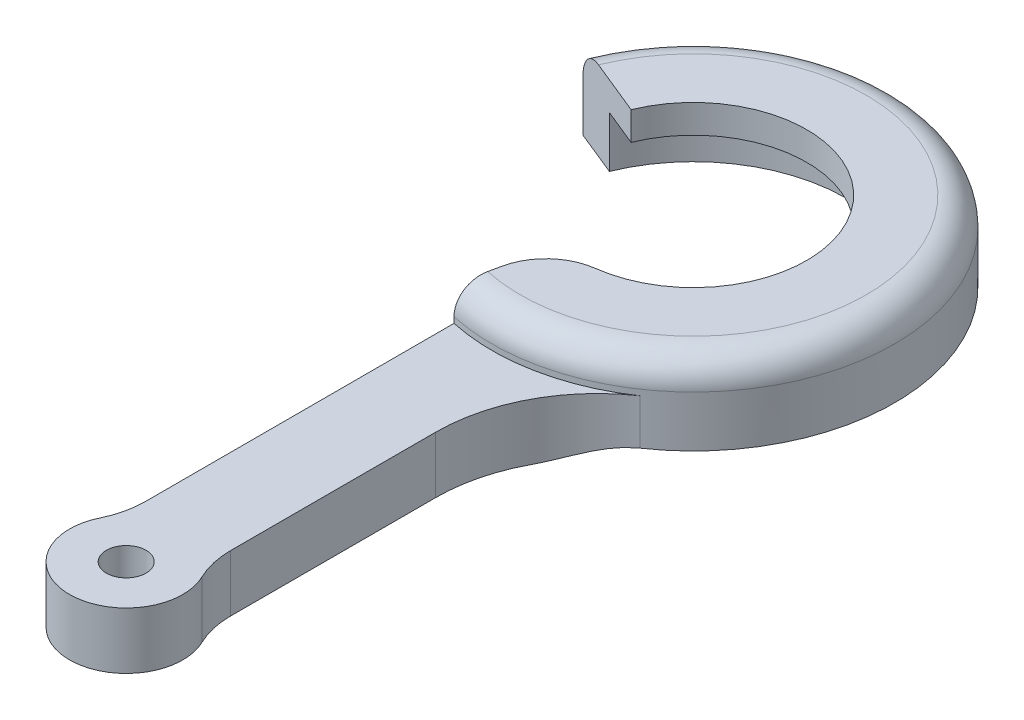
ISO-10303-21;
HEADER;
FILE_DESCRIPTION(('STEP AP214'),'2;1');
FILE_NAME('part.step','',(''),(''),'','','');
FILE_SCHEMA(('AUTOMOTIVE_DESIGN { 1 0 10303 214 1 1 1 1 }'));
ENDSEC;
DATA;
#1=APPLICATION_CONTEXT('core data for automotive mechanical design processes');
#2=APPLICATION_PROTOCOL_DEFINITION('international standard','automotive_design',2000,#1);
#3=PRODUCT_CONTEXT('',#1,'mechanical');
#4=PRODUCT('Part','Part','',(#3));
#5=PRODUCT_RELATED_PRODUCT_CATEGORY('part','',(#4));
#6=PRODUCT_DEFINITION_FORMATION('','',#4);
#7=PRODUCT_DEFINITION_CONTEXT('part definition',#1,'design');
#8=PRODUCT_DEFINITION('design','',#6,#7);
#9=PRODUCT_DEFINITION_SHAPE('','',#8);
#10=(LENGTH_UNIT() NAMED_UNIT(*) SI_UNIT(.MILLI.,.METRE.));
#11=(NAMED_UNIT(*) PLANE_ANGLE_UNIT() SI_UNIT($,.RADIAN.));
#12=(NAMED_UNIT(*) SI_UNIT($,.STERADIAN.) SOLID_ANGLE_UNIT());
#13=UNCERTAINTY_MEASURE_WITH_UNIT(LENGTH_MEASURE(1.E-05),#10,'distance_accuracy_value','');
#14=(GEOMETRIC_REPRESENTATION_CONTEXT(3) GLOBAL_UNCERTAINTY_ASSIGNED_CONTEXT((#13)) GLOBAL_UNIT_ASSIGNED_CONTEXT((#10,
#11,#12)) REPRESENTATION_CONTEXT('',''));
#15=CARTESIAN_POINT('',(0.,0.,0.));
#16=DIRECTION('',(0.,0.,1.));
#17=DIRECTION('',(1.,0.,0.));
#18=AXIS2_PLACEMENT_3D('',#15,#16,#17);
#19=CARTESIAN_POINT('',(0.,3.556,0.));
#20=DIRECTION('',(0.,1.,0.));
#21=DIRECTION('',(0.,0.,1.));
#22=AXIS2_PLACEMENT_3D('',#19,#20,#21);
#23=PLANE('',#22);
#24=DIRECTION('',(0.211267605633803,0.,-0.977428257628027));
#25=VECTOR('',#24,1.);
#26=CARTESIAN_POINT('',(0.,3.556,0.));
#27=LINE('',#26,#25);
#28=CARTESIAN_POINT('',(-1.63669014084507,3.556,7.57213671184433));
#29=VERTEX_POINT('',#28);
#30=CARTESIAN_POINT('',(-1.5215795100864,3.556,7.03957809776163));
#31=VERTEX_POINT('',#30);
#32=EDGE_CURVE('E367',#29,#31,#27,.T.);
#33=ORIENTED_EDGE('',*,*,#32,.F.);
#34=CARTESIAN_POINT('',(0.,3.556,0.));
#35=DIRECTION('',(0.,1.,0.));
#36=DIRECTION('',(0.,0.,1.));
#37=AXIS2_PLACEMENT_3D('',#34,#35,#36);
#38=CIRCLE('',#37,7.747);
#39=CARTESIAN_POINT('',(-7.17289068032949,3.556,-2.92671288103947));
#40=VERTEX_POINT('',#39);
#41=EDGE_CURVE('E255',#29,#40,#38,.T.);
#42=ORIENTED_EDGE('',*,*,#41,.T.);
#43=DIRECTION('',(-0.92589269140693,0.,-0.377786611725761));
#44=VECTOR('',#43,1.);
#45=CARTESIAN_POINT('',(0.,3.556,0.));
#46=LINE('',#45,#44);
#47=CARTESIAN_POINT('',(-4.70353487234721,3.556,-1.91915598756687));
#48=VERTEX_POINT('',#47);
#49=EDGE_CURVE('E361',#48,#40,#46,.T.);
#50=ORIENTED_EDGE('',*,*,#49,.F.);
#51=CARTESIAN_POINT('',(0.,3.556,0.));
#52=DIRECTION('',(0.,1.,0.));
#53=DIRECTION('',(0.,0.,1.));
#54=AXIS2_PLACEMENT_3D('',#51,#52,#53);
#55=CIRCLE('',#54,5.08);
#56=CARTESIAN_POINT('',(0.655092984739226,3.556,5.03758406196318));
#57=VERTEX_POINT('',#56);
#58=EDGE_CURVE('E192',#57,#48,#55,.T.);
#59=ORIENTED_EDGE('',*,*,#58,.F.);
#60=CARTESIAN_POINT('',(0.985914942032535,3.556,7.58156401325459));
#61=DIRECTION('',(0.,1.,0.));
#62=DIRECTION('',(0.,0.,1.));
#63=AXIS2_PLACEMENT_3D('',#60,#61,#62);
#64=CIRCLE('',#63,2.5654);
#65=EDGE_CURVE('E252',#57,#31,#64,.T.);
#66=ORIENTED_EDGE('',*,*,#65,.T.);
#67=EDGE_LOOP('',(#33,#42,#50,#59,#66));
#68=FACE_BOUND('',#67,.T.);
#69=ADVANCED_FACE('F37',(#68),#23,.T.);
#70=CARTESIAN_POINT('',(1.905,-20.3204916361345,0.));
#71=DIRECTION('',(-1.,0.,0.));
#72=DIRECTION('',(0.,0.,1.));
#73=AXIS2_PLACEMENT_3D('',#70,#71,#72);
#74=PLANE('',#73);
#75=DIRECTION('',(0.,0.,1.));
#76=VECTOR('',#75,1.);
#77=CARTESIAN_POINT('',(1.905,2.032,0.));
#78=LINE('',#77,#76);
#79=CARTESIAN_POINT('',(1.905,2.032,13.4404166602081));
#80=VERTEX_POINT('',#79);
#81=CARTESIAN_POINT('',(1.905,2.032,22.6320991708517));
#82=VERTEX_POINT('',#81);
#83=EDGE_CURVE('E304',#80,#82,#78,.T.);
#84=ORIENTED_EDGE('',*,*,#83,.T.);
#85=DIRECTION('',(0.,1.,0.));
#86=VECTOR('',#85,1.);
#87=CARTESIAN_POINT('',(1.905,-20.3204916361345,22.6320991708517));
#88=LINE('',#87,#86);
#89=CARTESIAN_POINT('',(1.905,-0.508000000000002,22.6320991708517));
#90=VERTEX_POINT('',#89);
#91=EDGE_CURVE('E269',#82,#90,#88,.F.);
#92=ORIENTED_EDGE('',*,*,#91,.T.);
#93=DIRECTION('',(0.,0.,-1.));
#94=VECTOR('',#93,1.);
#95=CARTESIAN_POINT('',(1.905,-0.508000000000002,0.));
#96=LINE('',#95,#94);
#97=CARTESIAN_POINT('',(1.905,-0.508000000000002,13.4404166602081));
#98=VERTEX_POINT('',#97);
#99=EDGE_CURVE('E182',#90,#98,#96,.T.);
#100=ORIENTED_EDGE('',*,*,#99,.T.);
#101=DIRECTION('',(0.,1.,0.));
#102=VECTOR('',#101,1.);
#103=CARTESIAN_POINT('',(1.905,2.032,13.4404166602081));
#104=LINE('',#103,#102);
#105=EDGE_CURVE('E293',#98,#80,#104,.T.);
#106=ORIENTED_EDGE('',*,*,#105,.T.);
#107=EDGE_LOOP('',(#84,#92,#100,#106));
#108=FACE_BOUND('',#107,.T.);
#109=ADVANCED_FACE('F314',(#108),#74,.F.);
#110=CARTESIAN_POINT('',(-1.905,-20.3204916361345,0.));
#111=DIRECTION('',(-1.,0.,0.));
#112=DIRECTION('',(0.,0.,1.));
#113=AXIS2_PLACEMENT_3D('',#110,#111,#112);
#114=PLANE('',#113);
#115=DIRECTION('',(0.,0.,-1.));
#116=VECTOR('',#115,1.);
#117=CARTESIAN_POINT('',(-1.905,-0.508000000000002,0.));
#118=LINE('',#117,#116);
#119=CARTESIAN_POINT('',(-1.905,-0.508000000000002,22.6320991708517));
#120=VERTEX_POINT('',#119);
#121=CARTESIAN_POINT('',(-1.905,-0.508000000000002,10.2323956456542));
#122=VERTEX_POINT('',#121);
#123=EDGE_CURVE('E190',#120,#122,#118,.T.);
#124=ORIENTED_EDGE('',*,*,#123,.F.);
#125=DIRECTION('',(0.,-1.,0.));
#126=VECTOR('',#125,1.);
#127=CARTESIAN_POINT('',(-1.905,2.032,22.6320991708517));
#128=LINE('',#127,#126);
#129=CARTESIAN_POINT('',(-1.905,2.032,22.6320991708517));
#130=VERTEX_POINT('',#129);
#131=EDGE_CURVE('E271',#120,#130,#128,.F.);
#132=ORIENTED_EDGE('',*,*,#131,.T.);
#133=DIRECTION('',(0.,0.,-1.));
#134=VECTOR('',#133,1.);
#135=CARTESIAN_POINT('',(-1.905,2.032,0.));
#136=LINE('',#135,#134);
#137=CARTESIAN_POINT('',(-1.905,2.032,8.81347059903192));
#138=VERTEX_POINT('',#137);
#139=EDGE_CURVE('E181',#130,#138,#136,.T.);
#140=ORIENTED_EDGE('',*,*,#139,.T.);
#141=DIRECTION('',(0.,1.,0.));
#142=VECTOR('',#141,1.);
#143=CARTESIAN_POINT('',(-1.905,-20.3204916361345,8.81347059903192));
#144=LINE('',#143,#142);
#145=CARTESIAN_POINT('',(-1.905,0.,8.81347059903192));
#146=VERTEX_POINT('',#145);
#147=EDGE_CURVE('E171',#146,#138,#144,.T.);
#148=ORIENTED_EDGE('',*,*,#147,.F.);
#149=CARTESIAN_POINT('',(-1.905,0.,8.81347059903192));
#150=CARTESIAN_POINT('',(-1.905,-0.0404267874109259,8.86255288851365));
#151=CARTESIAN_POINT('',(-1.905,-0.0787118145608285,8.91336231756037));
#152=CARTESIAN_POINT('',(-1.905,-0.150774272608477,9.01807032349325));
#153=CARTESIAN_POINT('',(-1.905,-0.184552489223622,9.07196835956328));
#154=CARTESIAN_POINT('',(-1.905,-0.276995145126199,9.23458032277125));
#155=CARTESIAN_POINT('',(-1.905,-0.32912088074064,9.34709405312444));
#156=CARTESIAN_POINT('',(-1.905,-0.415928659475305,9.58425029747693));
#157=CARTESIAN_POINT('',(-1.905,-0.449754149818826,9.70920741527858));
#158=CARTESIAN_POINT('',(-1.905,-0.484363734051546,9.90140074579367));
#159=CARTESIAN_POINT('',(-1.905,-0.493216160525349,9.96727500238598));
#160=CARTESIAN_POINT('',(-1.905,-0.505034632599743,10.0995537684059));
#161=CARTESIAN_POINT('',(-1.905,-0.508000291472687,10.1659583123827));
#162=CARTESIAN_POINT('',(-1.905,-0.508,10.2323956456542));
#163=B_SPLINE_CURVE_WITH_KNOTS('',3,(#149,#150,#151,#152,#153,#154,#155,#156,#157,#158,#159,
#160,#161,#162),.UNSPECIFIED.,.F.,.F.,(4,2,2,2,2,2,4),(0.,0.190648470048799,0.381263658889177,
0.751477463471262,1.13778069752751,1.33694885903953,1.53613010435087),.UNSPECIFIED.);
#164=EDGE_CURVE('E152',#146,#122,#163,.T.);
#165=ORIENTED_EDGE('',*,*,#164,.T.);
#166=EDGE_LOOP('',(#124,#132,#140,#148,#165));
#167=FACE_BOUND('',#166,.T.);
#168=ADVANCED_FACE('F179',(#167),#114,.T.);
#169=CARTESIAN_POINT('',(0.,2.286,0.));
#170=DIRECTION('',(0.,-1.,0.));
#171=DIRECTION('',(0.,0.,-1.));
#172=AXIS2_PLACEMENT_3D('',#169,#170,#171);
#173=CYLINDRICAL_SURFACE('',#172,9.017);
#174=DIRECTION('',(0.,1.,0.));
#175=VECTOR('',#174,1.);
#176=CARTESIAN_POINT('',(-8.34877439841629,-0.508000000000002,-3.40650187793119));
#177=LINE('',#176,#175);
#178=CARTESIAN_POINT('',(-8.34877439841629,0.,-3.40650187793119));
#179=VERTEX_POINT('',#178);
#180=CARTESIAN_POINT('',(-8.34877439841629,2.286,-3.40650187793119));
#181=VERTEX_POINT('',#180);
#182=EDGE_CURVE('E356',#179,#181,#177,.T.);
#183=ORIENTED_EDGE('',*,*,#182,.T.);
#184=CARTESIAN_POINT('',(0.,2.286,0.));
#185=DIRECTION('',(0.,1.,0.));
#186=DIRECTION('',(0.,0.,1.));
#187=AXIS2_PLACEMENT_3D('',#184,#185,#186);
#188=CIRCLE('',#187,9.017);
#189=CARTESIAN_POINT('',(-1.905,2.286,8.81347059903192));
#190=VERTEX_POINT('',#189);
#191=EDGE_CURVE('E260',#181,#190,#188,.F.);
#192=ORIENTED_EDGE('',*,*,#191,.T.);
#193=DIRECTION('',(0.,1.,0.));
#194=VECTOR('',#193,1.);
#195=CARTESIAN_POINT('',(-1.905,-0.508000000000002,8.81347059903192));
#196=LINE('',#195,#194);
#197=EDGE_CURVE('E360',#138,#190,#196,.T.);
#198=ORIENTED_EDGE('',*,*,#197,.F.);
#199=CARTESIAN_POINT('',(0.,2.032,0.));
#200=DIRECTION('',(0.,1.,0.));
#201=DIRECTION('',(0.,0.,1.));
#202=AXIS2_PLACEMENT_3D('',#199,#200,#201);
#203=CIRCLE('',#202,9.017);
#204=CARTESIAN_POINT('',(5.0720625,2.032,7.45523111620919));
#205=VERTEX_POINT('',#204);
#206=EDGE_CURVE('E303',#205,#138,#203,.F.);
#207=ORIENTED_EDGE('',*,*,#206,.F.);
#208=DIRECTION('',(0.,-1.,0.));
#209=VECTOR('',#208,1.);
#210=CARTESIAN_POINT('',(5.0720625,2.286,7.45523111620919));
#211=LINE('',#210,#209);
#212=CARTESIAN_POINT('',(5.0720625,0.,7.45523111620919));
#213=VERTEX_POINT('',#212);
#214=EDGE_CURVE('E301',#205,#213,#211,.T.);
#215=ORIENTED_EDGE('',*,*,#214,.T.);
#216=CARTESIAN_POINT('',(0.,0.,0.));
#217=DIRECTION('',(0.,1.,0.));
#218=DIRECTION('',(0.,0.,1.));
#219=AXIS2_PLACEMENT_3D('',#216,#217,#218);
#220=CIRCLE('',#219,9.017);
#221=EDGE_CURVE('E187',#213,#179,#220,.T.);
#222=ORIENTED_EDGE('',*,*,#221,.T.);
#223=EDGE_LOOP('',(#183,#192,#198,#207,#215,#222));
#224=FACE_BOUND('',#223,.T.);
#225=ADVANCED_FACE('F349',(#224),#173,.T.);
#226=CARTESIAN_POINT('',(0.,0.,0.));
#227=DIRECTION('',(0.,1.,0.));
#228=DIRECTION('',(0.,0.,1.));
#229=AXIS2_PLACEMENT_3D('',#226,#227,#228);
#230=PLANE('',#229);
#231=DIRECTION('',(0.211267605633803,0.,-0.977428257628027));
#232=VECTOR('',#231,1.);
#233=CARTESIAN_POINT('',(0.,0.,0.));
#234=LINE('',#233,#232);
#235=CARTESIAN_POINT('',(-1.84958735351915,0.,8.55710433626365));
#236=VERTEX_POINT('',#235);
#237=EDGE_CURVE('E168',#146,#236,#234,.T.);
#238=ORIENTED_EDGE('',*,*,#237,.T.);
#239=CARTESIAN_POINT('',(0.260680254699763,0.,9.01323109682702));
#240=DIRECTION('',(0.,1.,0.));
#241=DIRECTION('',(0.,0.,1.));
#242=AXIS2_PLACEMENT_3D('',#239,#240,#241);
#243=CIRCLE('',#242,2.159);
#244=CARTESIAN_POINT('',(0.198263855687144,0.,6.85513351026281));
#245=VERTEX_POINT('',#244);
#246=EDGE_CURVE('E206',#236,#245,#243,.F.);
#247=ORIENTED_EDGE('',*,*,#246,.T.);
#248=CARTESIAN_POINT('',(0.,0.,0.));
#249=DIRECTION('',(0.,1.,0.));
#250=DIRECTION('',(0.,0.,1.));
#251=AXIS2_PLACEMENT_3D('',#248,#249,#250);
#252=CIRCLE('',#251,6.858);
#253=CARTESIAN_POINT('',(-6.34977207766873,0.,-2.59086058321527));
#254=VERTEX_POINT('',#253);
#255=EDGE_CURVE('E199',#245,#254,#252,.T.);
#256=ORIENTED_EDGE('',*,*,#255,.T.);
#257=DIRECTION('',(-0.92589269140693,0.,-0.377786611725761));
#258=VECTOR('',#257,1.);
#259=CARTESIAN_POINT('',(0.,0.,0.));
#260=LINE('',#259,#258);
#261=EDGE_CURVE('E306',#254,#179,#260,.T.);
#262=ORIENTED_EDGE('',*,*,#261,.T.);
#263=ORIENTED_EDGE('',*,*,#221,.F.);
#264=CARTESIAN_POINT('',(0.,0.,0.));
#265=DIRECTION('',(0.,1.,0.));
#266=DIRECTION('',(0.,0.,1.));
#267=AXIS2_PLACEMENT_3D('',#264,#265,#266);
#268=CIRCLE('',#267,9.017);
#269=EDGE_CURVE('E157',#146,#213,#268,.T.);
#270=ORIENTED_EDGE('',*,*,#269,.F.);
#271=EDGE_LOOP('',(#238,#247,#256,#262,#263,#270));
#272=FACE_BOUND('',#271,.T.);
#273=ADVANCED_FACE('F185',(#272),#230,.F.);
#274=CARTESIAN_POINT('',(0.,2.286,0.));
#275=DIRECTION('',(0.,-1.,0.));
#276=DIRECTION('',(0.,0.,-1.));
#277=AXIS2_PLACEMENT_3D('',#274,#275,#276);
#278=CYLINDRICAL_SURFACE('',#277,6.858);
#279=ORIENTED_EDGE('',*,*,#255,.F.);
#280=DIRECTION('',(0.,-1.,0.));
#281=VECTOR('',#280,1.);
#282=CARTESIAN_POINT('',(0.198263855687144,2.286,6.85513351026281));
#283=LINE('',#282,#281);
#284=CARTESIAN_POINT('',(0.198263855687144,2.286,6.85513351026281));
#285=VERTEX_POINT('',#284);
#286=EDGE_CURVE('E208',#245,#285,#283,.F.);
#287=ORIENTED_EDGE('',*,*,#286,.T.);
#288=CARTESIAN_POINT('',(0.,2.286,0.));
#289=DIRECTION('',(0.,1.,0.));
#290=DIRECTION('',(0.,0.,1.));
#291=AXIS2_PLACEMENT_3D('',#288,#289,#290);
#292=CIRCLE('',#291,6.858);
#293=CARTESIAN_POINT('',(-6.34977207766873,2.286,-2.59086058321527));
#294=VERTEX_POINT('',#293);
#295=EDGE_CURVE('E196',#285,#294,#292,.T.);
#296=ORIENTED_EDGE('',*,*,#295,.T.);
#297=DIRECTION('',(0.,-1.,0.));
#298=VECTOR('',#297,1.);
#299=CARTESIAN_POINT('',(-6.34977207766873,2.286,-2.59086058321527));
#300=LINE('',#299,#298);
#301=EDGE_CURVE('E309',#254,#294,#300,.F.);
#302=ORIENTED_EDGE('',*,*,#301,.F.);
#303=EDGE_LOOP('',(#279,#287,#296,#302));
#304=FACE_BOUND('',#303,.T.);
#305=ADVANCED_FACE('F340',(#304),#278,.F.);
#306=CARTESIAN_POINT('',(0.,2.286,0.));
#307=DIRECTION('',(0.,1.,0.));
#308=DIRECTION('',(0.,0.,1.));
#309=AXIS2_PLACEMENT_3D('',#306,#307,#308);
#310=PLANE('',#309);
#311=DIRECTION('',(0.211267605633803,0.,-0.977428257628027));
#312=VECTOR('',#311,1.);
#313=CARTESIAN_POINT('',(0.,2.286,0.));
#314=LINE('',#313,#312);
#315=CARTESIAN_POINT('',(-1.84958735351915,2.286,8.55710433626365));
#316=VERTEX_POINT('',#315);
#317=CARTESIAN_POINT('',(-1.5215795100864,2.286,7.03957809776163));
#318=VERTEX_POINT('',#317);
#319=EDGE_CURVE('E177',#316,#318,#314,.T.);
#320=ORIENTED_EDGE('',*,*,#319,.T.);
#321=CARTESIAN_POINT('',(0.985914942032535,2.286,7.58156401325459));
#322=DIRECTION('',(0.,1.,0.));
#323=DIRECTION('',(0.,0.,1.));
#324=AXIS2_PLACEMENT_3D('',#321,#322,#323);
#325=CIRCLE('',#324,2.5654);
#326=CARTESIAN_POINT('',(0.655092984739226,2.286,5.03758406196318));
#327=VERTEX_POINT('',#326);
#328=EDGE_CURVE('E248',#318,#327,#325,.F.);
#329=ORIENTED_EDGE('',*,*,#328,.T.);
#330=CARTESIAN_POINT('',(0.,2.286,0.));
#331=DIRECTION('',(0.,1.,0.));
#332=DIRECTION('',(0.,0.,1.));
#333=AXIS2_PLACEMENT_3D('',#330,#331,#332);
#334=CIRCLE('',#333,5.08);
#335=CARTESIAN_POINT('',(-4.70353487234721,2.286,-1.91915598756687));
#336=VERTEX_POINT('',#335);
#337=EDGE_CURVE('E189',#327,#336,#334,.T.);
#338=ORIENTED_EDGE('',*,*,#337,.T.);
#339=DIRECTION('',(-0.92589269140693,0.,-0.377786611725761));
#340=VECTOR('',#339,1.);
#341=CARTESIAN_POINT('',(0.,2.286,0.));
#342=LINE('',#341,#340);
#343=EDGE_CURVE('E176',#336,#294,#342,.T.);
#344=ORIENTED_EDGE('',*,*,#343,.T.);
#345=ORIENTED_EDGE('',*,*,#295,.F.);
#346=CARTESIAN_POINT('',(0.260680254699763,2.286,9.01323109682702));
#347=DIRECTION('',(0.,1.,0.));
#348=DIRECTION('',(0.,0.,1.));
#349=AXIS2_PLACEMENT_3D('',#346,#347,#348);
#350=CIRCLE('',#349,2.159);
#351=EDGE_CURVE('E162',#285,#316,#350,.T.);
#352=ORIENTED_EDGE('',*,*,#351,.T.);
#353=EDGE_LOOP('',(#320,#329,#338,#344,#345,#352));
#354=FACE_BOUND('',#353,.T.);
#355=ADVANCED_FACE('F336',(#354),#310,.F.);
#356=CARTESIAN_POINT('',(0.,3.556,0.));
#357=DIRECTION('',(0.,-1.,0.));
#358=DIRECTION('',(0.,0.,-1.));
#359=AXIS2_PLACEMENT_3D('',#356,#357,#358);
#360=CYLINDRICAL_SURFACE('',#359,5.08);
#361=ORIENTED_EDGE('',*,*,#337,.F.);
#362=DIRECTION('',(0.,-1.,0.));
#363=VECTOR('',#362,1.);
#364=CARTESIAN_POINT('',(0.655092984739226,3.556,5.03758406196318));
#365=LINE('',#364,#363);
#366=EDGE_CURVE('E250',#327,#57,#365,.F.);
#367=ORIENTED_EDGE('',*,*,#366,.T.);
#368=ORIENTED_EDGE('',*,*,#58,.T.);
#369=DIRECTION('',(0.,-1.,0.));
#370=VECTOR('',#369,1.);
#371=CARTESIAN_POINT('',(-4.70353487234721,3.556,-1.91915598756687));
#372=LINE('',#371,#370);
#373=EDGE_CURVE('E202',#336,#48,#372,.F.);
#374=ORIENTED_EDGE('',*,*,#373,.F.);
#375=EDGE_LOOP('',(#361,#367,#368,#374));
#376=FACE_BOUND('',#375,.T.);
#377=ADVANCED_FACE('F339',(#376),#360,.F.);
#378=CARTESIAN_POINT('',(0.,-0.508,0.));
#379=DIRECTION('',(0.,1.,0.));
#380=DIRECTION('',(0.,0.,1.));
#381=AXIS2_PLACEMENT_3D('',#378,#379,#380);
#382=PLANE('',#381);
#383=CARTESIAN_POINT('',(0.,-0.508,25.4));
#384=DIRECTION('',(0.,1.,0.));
#385=DIRECTION('',(0.,0.,1.));
#386=AXIS2_PLACEMENT_3D('',#383,#384,#385);
#387=CIRCLE('',#386,0.889);
#388=CARTESIAN_POINT('',(0.,-0.508,26.289));
#389=VERTEX_POINT('',#388);
#390=EDGE_CURVE('E287',#389,#389,#387,.T.);
#391=ORIENTED_EDGE('',*,*,#390,.T.);
#392=EDGE_LOOP('',(#391));
#393=FACE_BOUND('',#392,.T.);
#394=ORIENTED_EDGE('',*,*,#99,.F.);
#395=CARTESIAN_POINT('',(5.715,-0.508000000000001,22.6320991708517));
#396=DIRECTION('',(0.,1.,0.));
#397=DIRECTION('',(0.,0.,1.));
#398=AXIS2_PLACEMENT_3D('',#395,#396,#397);
#399=CIRCLE('',#398,3.81);
#400=CARTESIAN_POINT('',(2.286,-0.508000000000001,24.2928396683407));
#401=VERTEX_POINT('',#400);
#402=EDGE_CURVE('E275',#90,#401,#399,.T.);
#403=ORIENTED_EDGE('',*,*,#402,.T.);
#404=CARTESIAN_POINT('',(0.,-0.508000000000001,25.4));
#405=DIRECTION('',(0.,1.,0.));
#406=DIRECTION('',(0.,0.,1.));
#407=AXIS2_PLACEMENT_3D('',#404,#405,#406);
#408=CIRCLE('',#407,2.54);
#409=CARTESIAN_POINT('',(-2.286,-0.508000000000001,24.2928396683407));
#410=VERTEX_POINT('',#409);
#411=EDGE_CURVE('E286',#401,#410,#408,.F.);
#412=ORIENTED_EDGE('',*,*,#411,.T.);
#413=CARTESIAN_POINT('',(-5.715,-0.508000000000001,22.6320991708517));
#414=DIRECTION('',(0.,1.,0.));
#415=DIRECTION('',(0.,0.,1.));
#416=AXIS2_PLACEMENT_3D('',#413,#414,#415);
#417=CIRCLE('',#416,3.81);
#418=EDGE_CURVE('E12',#410,#120,#417,.T.);
#419=ORIENTED_EDGE('',*,*,#418,.T.);
#420=ORIENTED_EDGE('',*,*,#123,.T.);
#421=CARTESIAN_POINT('',(0.,-0.508,0.));
#422=DIRECTION('',(0.,1.,0.));
#423=DIRECTION('',(0.,0.,1.));
#424=AXIS2_PLACEMENT_3D('',#421,#422,#423);
#425=CIRCLE('',#424,10.4082152960631);
#426=CARTESIAN_POINT('',(2.75496305969724,-0.508,10.036987804561));
#427=VERTEX_POINT('',#426);
#428=EDGE_CURVE('E159',#122,#427,#425,.T.);
#429=ORIENTED_EDGE('',*,*,#428,.T.);
#430=CARTESIAN_POINT('',(9.144,-0.508,13.4404166602081));
#431=DIRECTION('',(0.,1.,0.));
#432=DIRECTION('',(0.,0.,1.));
#433=AXIS2_PLACEMENT_3D('',#430,#431,#432);
#434=CIRCLE('',#433,7.239);
#435=EDGE_CURVE('E240',#427,#98,#434,.T.);
#436=ORIENTED_EDGE('',*,*,#435,.T.);
#437=EDGE_LOOP('',(#394,#403,#412,#419,#420,#429,#436));
#438=FACE_BOUND('',#437,.T.);
#439=ADVANCED_FACE('F290',(#393,#438),#382,.F.);
#440=CARTESIAN_POINT('',(0.,2.032,0.));
#441=DIRECTION('',(0.,1.,0.));
#442=DIRECTION('',(0.,0.,1.));
#443=AXIS2_PLACEMENT_3D('',#440,#441,#442);
#444=PLANE('',#443);
#445=CARTESIAN_POINT('',(0.,2.032,25.4));
#446=DIRECTION('',(0.,1.,0.));
#447=DIRECTION('',(0.,0.,1.));
#448=AXIS2_PLACEMENT_3D('',#445,#446,#447);
#449=CIRCLE('',#448,0.889);
#450=CARTESIAN_POINT('',(0.,2.032,26.289));
#451=VERTEX_POINT('',#450);
#452=EDGE_CURVE('E415',#451,#451,#449,.T.);
#453=ORIENTED_EDGE('',*,*,#452,.F.);
#454=EDGE_LOOP('',(#453));
#455=FACE_BOUND('',#454,.T.);
#456=ORIENTED_EDGE('',*,*,#139,.F.);
#457=CARTESIAN_POINT('',(-5.715,2.032,22.6320991708517));
#458=DIRECTION('',(0.,1.,0.));
#459=DIRECTION('',(0.,0.,1.));
#460=AXIS2_PLACEMENT_3D('',#457,#458,#459);
#461=CIRCLE('',#460,3.81);
#462=CARTESIAN_POINT('',(-2.286,2.032,24.2928396683407));
#463=VERTEX_POINT('',#462);
#464=EDGE_CURVE('E45',#130,#463,#461,.F.);
#465=ORIENTED_EDGE('',*,*,#464,.T.);
#466=CARTESIAN_POINT('',(0.,2.032,25.4));
#467=DIRECTION('',(0.,1.,0.));
#468=DIRECTION('',(0.,0.,1.));
#469=AXIS2_PLACEMENT_3D('',#466,#467,#468);
#470=CIRCLE('',#469,2.54);
#471=CARTESIAN_POINT('',(2.286,2.032,24.2928396683407));
#472=VERTEX_POINT('',#471);
#473=EDGE_CURVE('E280',#463,#472,#470,.T.);
#474=ORIENTED_EDGE('',*,*,#473,.T.);
#475=CARTESIAN_POINT('',(5.715,2.032,22.6320991708517));
#476=DIRECTION('',(0.,1.,0.));
#477=DIRECTION('',(0.,0.,1.));
#478=AXIS2_PLACEMENT_3D('',#475,#476,#477);
#479=CIRCLE('',#478,3.81);
#480=EDGE_CURVE('E273',#472,#82,#479,.F.);
#481=ORIENTED_EDGE('',*,*,#480,.T.);
#482=ORIENTED_EDGE('',*,*,#83,.F.);
#483=CARTESIAN_POINT('',(9.144,2.032,13.4404166602081));
#484=DIRECTION('',(0.,1.,0.));
#485=DIRECTION('',(0.,0.,1.));
#486=AXIS2_PLACEMENT_3D('',#483,#484,#485);
#487=CIRCLE('',#486,7.239);
#488=EDGE_CURVE('E241',#80,#205,#487,.F.);
#489=ORIENTED_EDGE('',*,*,#488,.T.);
#490=ORIENTED_EDGE('',*,*,#206,.T.);
#491=EDGE_LOOP('',(#456,#465,#474,#481,#482,#489,#490));
#492=FACE_BOUND('',#491,.T.);
#493=ADVANCED_FACE('F279',(#455,#492),#444,.T.);
#494=CARTESIAN_POINT('',(0.,-0.508000000000002,0.));
#495=DIRECTION('',(0.377786611725761,0.,-0.92589269140693));
#496=DIRECTION('',(-0.92589269140693,0.,-0.377786611725761));
#497=AXIS2_PLACEMENT_3D('',#494,#495,#496);
#498=PLANE('',#497);
#499=ORIENTED_EDGE('',*,*,#49,.T.);
#500=CARTESIAN_POINT('',(-7.17289068032949,2.286,-2.92671288103947));
#501=DIRECTION('',(0.377786611725761,0.,-0.92589269140693));
#502=DIRECTION('',(-0.92589269140693,0.,-0.377786611725761));
#503=AXIS2_PLACEMENT_3D('',#500,#501,#502);
#504=CIRCLE('',#503,1.27);
#505=EDGE_CURVE('E258',#40,#181,#504,.F.);
#506=ORIENTED_EDGE('',*,*,#505,.T.);
#507=ORIENTED_EDGE('',*,*,#182,.F.);
#508=ORIENTED_EDGE('',*,*,#261,.F.);
#509=ORIENTED_EDGE('',*,*,#301,.T.);
#510=ORIENTED_EDGE('',*,*,#343,.F.);
#511=ORIENTED_EDGE('',*,*,#373,.T.);
#512=EDGE_LOOP('',(#499,#506,#507,#508,#509,#510,#511));
#513=FACE_BOUND('',#512,.T.);
#514=ADVANCED_FACE('F384',(#513),#498,.F.);
#515=CARTESIAN_POINT('',(0.,-0.508000000000002,0.));
#516=DIRECTION('',(0.977428257628027,0.,0.211267605633803));
#517=DIRECTION('',(0.211267605633803,0.,-0.977428257628027));
#518=AXIS2_PLACEMENT_3D('',#515,#516,#517);
#519=PLANE('',#518);
#520=ORIENTED_EDGE('',*,*,#197,.T.);
#521=CARTESIAN_POINT('',(-1.63669014084507,2.286,7.57213671184432));
#522=DIRECTION('',(0.977428257628027,0.,0.211267605633803));
#523=DIRECTION('',(0.211267605633803,0.,-0.977428257628027));
#524=AXIS2_PLACEMENT_3D('',#521,#522,#523);
#525=CIRCLE('',#524,1.27);
#526=EDGE_CURVE('E262',#190,#29,#525,.F.);
#527=ORIENTED_EDGE('',*,*,#526,.T.);
#528=ORIENTED_EDGE('',*,*,#32,.T.);
#529=DIRECTION('',(0.,1.,0.));
#530=VECTOR('',#529,1.);
#531=CARTESIAN_POINT('',(-1.5215795100864,2.286,7.03957809776163));
#532=LINE('',#531,#530);
#533=EDGE_CURVE('E245',#31,#318,#532,.F.);
#534=ORIENTED_EDGE('',*,*,#533,.T.);
#535=ORIENTED_EDGE('',*,*,#319,.F.);
#536=DIRECTION('',(0.,1.,0.));
#537=VECTOR('',#536,1.);
#538=CARTESIAN_POINT('',(-1.84958735351915,0.,8.55710433626364));
#539=LINE('',#538,#537);
#540=EDGE_CURVE('E174',#316,#236,#539,.F.);
#541=ORIENTED_EDGE('',*,*,#540,.T.);
#542=ORIENTED_EDGE('',*,*,#237,.F.);
#543=ORIENTED_EDGE('',*,*,#147,.T.);
#544=EDGE_LOOP('',(#520,#527,#528,#534,#535,#541,#542,#543));
#545=FACE_BOUND('',#544,.T.);
#546=ADVANCED_FACE('F170',(#545),#519,.F.);
#547=CARTESIAN_POINT('',(0.260680254699763,2.286,9.01323109682702));
#548=DIRECTION('',(0.,-1.,0.));
#549=DIRECTION('',(0.,0.,-1.));
#550=AXIS2_PLACEMENT_3D('',#547,#548,#549);
#551=CYLINDRICAL_SURFACE('',#550,2.159);
#552=ORIENTED_EDGE('',*,*,#351,.F.);
#553=ORIENTED_EDGE('',*,*,#286,.F.);
#554=ORIENTED_EDGE('',*,*,#246,.F.);
#555=ORIENTED_EDGE('',*,*,#540,.F.);
#556=EDGE_LOOP('',(#552,#553,#554,#555));
#557=FACE_BOUND('',#556,.T.);
#558=ADVANCED_FACE('F227',(#557),#551,.T.);
#559=CARTESIAN_POINT('',(0.,1.651,0.));
#560=DIRECTION('',(0.,1.,0.));
#561=DIRECTION('',(0.,0.,1.));
#562=AXIS2_PLACEMENT_3D('',#559,#560,#561);
#563=TOROIDAL_SURFACE('',#562,10.4082152960631,2.159);
#564=ORIENTED_EDGE('',*,*,#269,.T.);
#565=CARTESIAN_POINT('',(5.0720625,0.,7.45523111620919));
#566=CARTESIAN_POINT('',(5.01877385403601,1.94842654477591E-05,7.49148290957976));
#567=CARTESIAN_POINT('',(4.96597643981351,-0.00130713871875787,7.5284462225559));
#568=CARTESIAN_POINT('',(4.8614884268204,-0.0065073322970082,7.60369230806409));
#569=CARTESIAN_POINT('',(4.8097974037803,-0.0103799078447079,7.64197455957251));
#570=CARTESIAN_POINT('',(4.70777018549762,-0.0205105218833064,7.71965742757702));
#571=CARTESIAN_POINT('',(4.65743014524509,-0.0267607955492472,7.75905402137858));
#572=CARTESIAN_POINT('',(4.55799640728767,-0.0413872463877484,7.83900946887381));
#573=CARTESIAN_POINT('',(4.50890282325802,-0.0497636166970324,7.8795684278608));
#574=CARTESIAN_POINT('',(4.36320386396787,-0.0776884376889094,8.00319542284459));
#575=CARTESIAN_POINT('',(4.26854030197823,-0.0999928030649329,8.08793912534231));
#576=CARTESIAN_POINT('',(4.08435008184894,-0.149060523143149,8.26169858626866));
#577=CARTESIAN_POINT('',(3.99482805235842,-0.17582781353523,8.3507180655789));
#578=CARTESIAN_POINT('',(3.8115715593479,-0.233802563040139,8.5426873891146));
#579=CARTESIAN_POINT('',(3.71839210450726,-0.265180284161377,8.64611507742676));
#580=CARTESIAN_POINT('',(3.5378824415773,-0.326129891656739,8.85849738869722));
#581=CARTESIAN_POINT('',(3.45055270717446,-0.355701631772817,8.96745245798789));
#582=CARTESIAN_POINT('',(3.28221822455914,-0.409392707821081,9.19047046426627));
#583=CARTESIAN_POINT('',(3.2011806709943,-0.43354176872839,9.30450123338603));
#584=CARTESIAN_POINT('',(3.04525703366017,-0.473143175720727,9.53809461909801));
#585=CARTESIAN_POINT('',(2.97036420204183,-0.488605173722543,9.65765093588744));
#586=CARTESIAN_POINT('',(2.8740664308962,-0.501201154312184,9.82192749742286));
#587=CARTESIAN_POINT('',(2.84967822344009,-0.503709801882565,9.86451866025256));
#588=CARTESIAN_POINT('',(2.80170030091375,-0.50711060937088,9.95031991866372));
#589=CARTESIAN_POINT('',(2.77811222725999,-0.50799962285291,9.9935310549599));
#590=CARTESIAN_POINT('',(2.75496305969747,-0.508,10.0369878045613));
#591=B_SPLINE_CURVE_WITH_KNOTS('',3,(#565,#566,#567,#568,#569,#570,#571,#572,#573,#574,#575,
#576,#577,#578,#579,#580,#581,#582,#583,#584,#585,#586,#587,#588,#589,#590),.UNSPECIFIED.,.F.,
.F.,(4,2,2,2,2,2,2,2,2,2,2,2,4),(0.,0.193322623355197,0.386569734422704,0.579191103859185,
0.771829977477855,1.15846702504991,1.54544685474979,1.9733325296938,2.40125281129217,
2.82676680441488,3.25180708288141,3.39920644441395,3.54689185210041),.UNSPECIFIED.);
#592=EDGE_CURVE('E233',#213,#427,#591,.T.);
#593=ORIENTED_EDGE('',*,*,#592,.T.);
#594=ORIENTED_EDGE('',*,*,#428,.F.);
#595=ORIENTED_EDGE('',*,*,#164,.F.);
#596=EDGE_LOOP('',(#564,#593,#594,#595));
#597=FACE_BOUND('',#596,.T.);
#598=ADVANCED_FACE('F154',(#597),#563,.T.);
#599=CARTESIAN_POINT('',(9.144,2.286,13.4404166602081));
#600=DIRECTION('',(0.,-1.,0.));
#601=DIRECTION('',(0.,0.,-1.));
#602=AXIS2_PLACEMENT_3D('',#599,#600,#601);
#603=CYLINDRICAL_SURFACE('',#602,7.239);
#604=ORIENTED_EDGE('',*,*,#592,.F.);
#605=ORIENTED_EDGE('',*,*,#214,.F.);
#606=ORIENTED_EDGE('',*,*,#488,.F.);
#607=ORIENTED_EDGE('',*,*,#105,.F.);
#608=ORIENTED_EDGE('',*,*,#435,.F.);
#609=EDGE_LOOP('',(#604,#605,#606,#607,#608));
#610=FACE_BOUND('',#609,.T.);
#611=ADVANCED_FACE('F226',(#610),#603,.F.);
#612=CARTESIAN_POINT('',(0.985914942032535,3.556,7.58156401325459));
#613=DIRECTION('',(0.,-1.,0.));
#614=DIRECTION('',(0.,0.,-1.));
#615=AXIS2_PLACEMENT_3D('',#612,#613,#614);
#616=CYLINDRICAL_SURFACE('',#615,2.5654);
#617=ORIENTED_EDGE('',*,*,#65,.F.);
#618=ORIENTED_EDGE('',*,*,#366,.F.);
#619=ORIENTED_EDGE('',*,*,#328,.F.);
#620=ORIENTED_EDGE('',*,*,#533,.F.);
#621=EDGE_LOOP('',(#617,#618,#619,#620));
#622=FACE_BOUND('',#621,.T.);
#623=ADVANCED_FACE('F392',(#622),#616,.T.);
#624=CARTESIAN_POINT('',(0.,2.286,0.));
#625=DIRECTION('',(0.,1.,0.));
#626=DIRECTION('',(0.,0.,1.));
#627=AXIS2_PLACEMENT_3D('',#624,#625,#626);
#628=TOROIDAL_SURFACE('',#627,7.747,1.27);
#629=ORIENTED_EDGE('',*,*,#526,.F.);
#630=ORIENTED_EDGE('',*,*,#191,.F.);
#631=ORIENTED_EDGE('',*,*,#505,.F.);
#632=ORIENTED_EDGE('',*,*,#41,.F.);
#633=EDGE_LOOP('',(#629,#630,#631,#632));
#634=FACE_BOUND('',#633,.T.);
#635=ADVANCED_FACE('F365',(#634),#628,.T.);
#636=CARTESIAN_POINT('',(0.,-7.11218349073012,25.4));
#637=DIRECTION('',(0.,1.,0.));
#638=DIRECTION('',(0.,0.,1.));
#639=AXIS2_PLACEMENT_3D('',#636,#637,#638);
#640=CYLINDRICAL_SURFACE('',#639,2.54);
#641=ORIENTED_EDGE('',*,*,#411,.F.);
#642=DIRECTION('',(0.,1.,0.));
#643=VECTOR('',#642,1.);
#644=CARTESIAN_POINT('',(2.286,-7.11218349073012,24.2928396683407));
#645=LINE('',#644,#643);
#646=EDGE_CURVE('E266',#401,#472,#645,.T.);
#647=ORIENTED_EDGE('',*,*,#646,.T.);
#648=ORIENTED_EDGE('',*,*,#473,.F.);
#649=DIRECTION('',(0.,1.,0.));
#650=VECTOR('',#649,1.);
#651=CARTESIAN_POINT('',(-2.286,-7.11218349073012,24.2928396683407));
#652=LINE('',#651,#650);
#653=EDGE_CURVE('E264',#463,#410,#652,.F.);
#654=ORIENTED_EDGE('',*,*,#653,.T.);
#655=EDGE_LOOP('',(#641,#647,#648,#654));
#656=FACE_BOUND('',#655,.T.);
#657=ADVANCED_FACE('F284',(#656),#640,.T.);
#658=CARTESIAN_POINT('',(0.,-0.508,25.4));
#659=DIRECTION('',(0.,1.,0.));
#660=DIRECTION('',(0.,0.,1.));
#661=AXIS2_PLACEMENT_3D('',#658,#659,#660);
#662=CYLINDRICAL_SURFACE('',#661,0.889);
#663=ORIENTED_EDGE('',*,*,#390,.F.);
#664=EDGE_LOOP('',(#663));
#665=FACE_BOUND('',#664,.T.);
#666=ORIENTED_EDGE('',*,*,#452,.T.);
#667=EDGE_LOOP('',(#666));
#668=FACE_BOUND('',#667,.T.);
#669=ADVANCED_FACE('F319',(#665,#668),#662,.F.);
#670=CARTESIAN_POINT('',(5.715,-7.11218349073012,22.6320991708517));
#671=DIRECTION('',(0.,1.,0.));
#672=DIRECTION('',(0.,0.,1.));
#673=AXIS2_PLACEMENT_3D('',#670,#671,#672);
#674=CYLINDRICAL_SURFACE('',#673,3.81);
#675=ORIENTED_EDGE('',*,*,#402,.F.);
#676=ORIENTED_EDGE('',*,*,#91,.F.);
#677=ORIENTED_EDGE('',*,*,#480,.F.);
#678=ORIENTED_EDGE('',*,*,#646,.F.);
#679=EDGE_LOOP('',(#675,#676,#677,#678));
#680=FACE_BOUND('',#679,.T.);
#681=ADVANCED_FACE('F317',(#680),#674,.F.);
#682=CARTESIAN_POINT('',(-5.715,-7.11218349073012,22.6320991708517));
#683=DIRECTION('',(0.,1.,0.));
#684=DIRECTION('',(0.,0.,1.));
#685=AXIS2_PLACEMENT_3D('',#682,#683,#684);
#686=CYLINDRICAL_SURFACE('',#685,3.81);
#687=ORIENTED_EDGE('',*,*,#418,.F.);
#688=ORIENTED_EDGE('',*,*,#653,.F.);
#689=ORIENTED_EDGE('',*,*,#464,.F.);
#690=ORIENTED_EDGE('',*,*,#131,.F.);
#691=EDGE_LOOP('',(#687,#688,#689,#690));
#692=FACE_BOUND('',#691,.T.);
#693=ADVANCED_FACE('F39',(#692),#686,.F.);
#694=CLOSED_SHELL('',(#69,#109,#168,#225,#273,#305,#355,#377,#439,#493,#514,#546,#558,#598,#611,
#623,#635,#657,#669,#681,#693));
#695=MANIFOLD_SOLID_BREP('B2',#694);
#696=ADVANCED_BREP_SHAPE_REPRESENTATION('',(#18,#695),#14);
#697=SHAPE_DEFINITION_REPRESENTATION(#9,#696);
ENDSEC;
END-ISO-10303-21;
